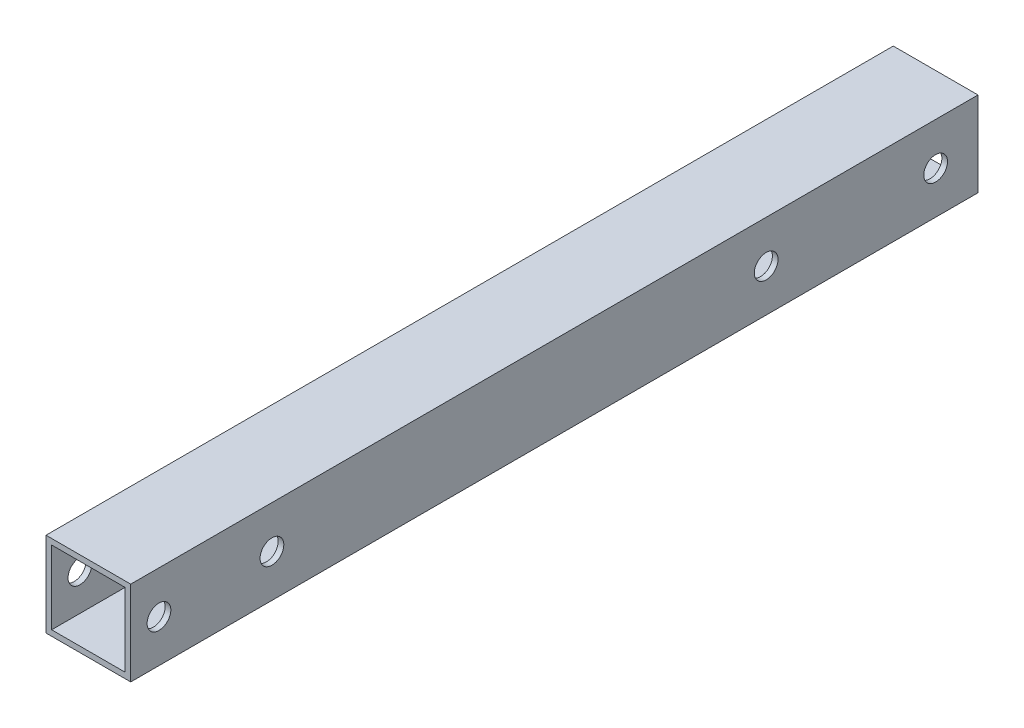
ISO-10303-21;
HEADER;
FILE_DESCRIPTION(('STEP AP214'),'2;1');
FILE_NAME('part.step','',(''),(''),'','','');
FILE_SCHEMA(('AUTOMOTIVE_DESIGN { 1 0 10303 214 1 1 1 1 }'));
ENDSEC;
DATA;
#1=APPLICATION_CONTEXT('core data for automotive mechanical design processes');
#2=APPLICATION_PROTOCOL_DEFINITION('international standard','automotive_design',2000,#1);
#3=PRODUCT_CONTEXT('',#1,'mechanical');
#4=PRODUCT('Part','Part','',(#3));
#5=PRODUCT_RELATED_PRODUCT_CATEGORY('part','',(#4));
#6=PRODUCT_DEFINITION_FORMATION('','',#4);
#7=PRODUCT_DEFINITION_CONTEXT('part definition',#1,'design');
#8=PRODUCT_DEFINITION('design','',#6,#7);
#9=PRODUCT_DEFINITION_SHAPE('','',#8);
#10=(LENGTH_UNIT() NAMED_UNIT(*) SI_UNIT(.MILLI.,.METRE.));
#11=(NAMED_UNIT(*) PLANE_ANGLE_UNIT() SI_UNIT($,.RADIAN.));
#12=(NAMED_UNIT(*) SI_UNIT($,.STERADIAN.) SOLID_ANGLE_UNIT());
#13=UNCERTAINTY_MEASURE_WITH_UNIT(LENGTH_MEASURE(1.E-05),#10,'distance_accuracy_value','');
#14=(GEOMETRIC_REPRESENTATION_CONTEXT(3) GLOBAL_UNCERTAINTY_ASSIGNED_CONTEXT((#13)) GLOBAL_UNIT_ASSIGNED_CONTEXT((#10,
#11,#12)) REPRESENTATION_CONTEXT('',''));
#15=CARTESIAN_POINT('',(0.,0.,0.));
#16=DIRECTION('',(0.,0.,1.));
#17=DIRECTION('',(1.,0.,0.));
#18=AXIS2_PLACEMENT_3D('',#15,#16,#17);
#19=CARTESIAN_POINT('',(0.,0.,150.));
#20=DIRECTION('',(0.,0.,1.));
#21=DIRECTION('',(1.,0.,0.));
#22=AXIS2_PLACEMENT_3D('',#19,#20,#21);
#23=PLANE('',#22);
#24=DIRECTION('',(0.,-1.,0.));
#25=VECTOR('',#24,1.);
#26=CARTESIAN_POINT('',(-7.5,7.5,150.));
#27=LINE('',#26,#25);
#28=CARTESIAN_POINT('',(-7.5,7.5,150.));
#29=VERTEX_POINT('',#28);
#30=CARTESIAN_POINT('',(-7.5,-7.5,150.));
#31=VERTEX_POINT('',#30);
#32=EDGE_CURVE('E164',#29,#31,#27,.T.);
#33=ORIENTED_EDGE('',*,*,#32,.T.);
#34=DIRECTION('',(1.,0.,0.));
#35=VECTOR('',#34,1.);
#36=CARTESIAN_POINT('',(7.5,-7.5,150.));
#37=LINE('',#36,#35);
#38=CARTESIAN_POINT('',(7.5,-7.5,150.));
#39=VERTEX_POINT('',#38);
#40=EDGE_CURVE('E167',#31,#39,#37,.T.);
#41=ORIENTED_EDGE('',*,*,#40,.T.);
#42=DIRECTION('',(0.,1.,0.));
#43=VECTOR('',#42,1.);
#44=CARTESIAN_POINT('',(7.5,7.5,150.));
#45=LINE('',#44,#43);
#46=CARTESIAN_POINT('',(7.5,7.5,150.));
#47=VERTEX_POINT('',#46);
#48=EDGE_CURVE('E170',#39,#47,#45,.T.);
#49=ORIENTED_EDGE('',*,*,#48,.T.);
#50=DIRECTION('',(-1.,0.,0.));
#51=VECTOR('',#50,1.);
#52=CARTESIAN_POINT('',(7.5,7.5,150.));
#53=LINE('',#52,#51);
#54=EDGE_CURVE('E172',#47,#29,#53,.T.);
#55=ORIENTED_EDGE('',*,*,#54,.T.);
#56=EDGE_LOOP('',(#33,#41,#49,#55));
#57=FACE_BOUND('',#56,.T.);
#58=DIRECTION('',(1.,0.,0.));
#59=VECTOR('',#58,1.);
#60=CARTESIAN_POINT('',(0.,-6.5,150.));
#61=LINE('',#60,#59);
#62=CARTESIAN_POINT('',(-6.5,-6.5,150.));
#63=VERTEX_POINT('',#62);
#64=CARTESIAN_POINT('',(6.5,-6.5,150.));
#65=VERTEX_POINT('',#64);
#66=EDGE_CURVE('E134',#63,#65,#61,.T.);
#67=ORIENTED_EDGE('',*,*,#66,.F.);
#68=DIRECTION('',(0.,-1.,0.));
#69=VECTOR('',#68,1.);
#70=CARTESIAN_POINT('',(-6.5,0.,150.));
#71=LINE('',#70,#69);
#72=CARTESIAN_POINT('',(-6.5,6.5,150.));
#73=VERTEX_POINT('',#72);
#74=EDGE_CURVE('E126',#73,#63,#71,.T.);
#75=ORIENTED_EDGE('',*,*,#74,.F.);
#76=DIRECTION('',(-1.,0.,0.));
#77=VECTOR('',#76,1.);
#78=CARTESIAN_POINT('',(0.,6.5,150.));
#79=LINE('',#78,#77);
#80=CARTESIAN_POINT('',(6.5,6.5,150.));
#81=VERTEX_POINT('',#80);
#82=EDGE_CURVE('E148',#81,#73,#79,.T.);
#83=ORIENTED_EDGE('',*,*,#82,.F.);
#84=DIRECTION('',(0.,1.,0.));
#85=VECTOR('',#84,1.);
#86=CARTESIAN_POINT('',(6.5,0.,150.));
#87=LINE('',#86,#85);
#88=EDGE_CURVE('E146',#65,#81,#87,.T.);
#89=ORIENTED_EDGE('',*,*,#88,.F.);
#90=EDGE_LOOP('',(#67,#75,#83,#89));
#91=FACE_BOUND('',#90,.T.);
#92=ADVANCED_FACE('F59',(#57,#91),#23,.T.);
#93=CARTESIAN_POINT('',(0.,0.,0.));
#94=DIRECTION('',(0.,0.,1.));
#95=DIRECTION('',(1.,0.,0.));
#96=AXIS2_PLACEMENT_3D('',#93,#94,#95);
#97=PLANE('',#96);
#98=DIRECTION('',(0.,-1.,0.));
#99=VECTOR('',#98,1.);
#100=CARTESIAN_POINT('',(-7.5,7.5,0.));
#101=LINE('',#100,#99);
#102=CARTESIAN_POINT('',(-7.5,7.5,0.));
#103=VERTEX_POINT('',#102);
#104=CARTESIAN_POINT('',(-7.5,-7.5,0.));
#105=VERTEX_POINT('',#104);
#106=EDGE_CURVE('E142',#103,#105,#101,.T.);
#107=ORIENTED_EDGE('',*,*,#106,.F.);
#108=DIRECTION('',(-1.,0.,0.));
#109=VECTOR('',#108,1.);
#110=CARTESIAN_POINT('',(7.5,7.5,0.));
#111=LINE('',#110,#109);
#112=CARTESIAN_POINT('',(7.5,7.5,0.));
#113=VERTEX_POINT('',#112);
#114=EDGE_CURVE('E168',#113,#103,#111,.T.);
#115=ORIENTED_EDGE('',*,*,#114,.F.);
#116=DIRECTION('',(0.,1.,0.));
#117=VECTOR('',#116,1.);
#118=CARTESIAN_POINT('',(7.5,7.5,0.));
#119=LINE('',#118,#117);
#120=CARTESIAN_POINT('',(7.5,-7.5,0.));
#121=VERTEX_POINT('',#120);
#122=EDGE_CURVE('E179',#121,#113,#119,.T.);
#123=ORIENTED_EDGE('',*,*,#122,.F.);
#124=DIRECTION('',(1.,0.,0.));
#125=VECTOR('',#124,1.);
#126=CARTESIAN_POINT('',(7.5,-7.5,0.));
#127=LINE('',#126,#125);
#128=EDGE_CURVE('E177',#105,#121,#127,.T.);
#129=ORIENTED_EDGE('',*,*,#128,.F.);
#130=EDGE_LOOP('',(#107,#115,#123,#129));
#131=FACE_BOUND('',#130,.T.);
#132=DIRECTION('',(0.,-1.,0.));
#133=VECTOR('',#132,1.);
#134=CARTESIAN_POINT('',(-6.5,0.,0.));
#135=LINE('',#134,#133);
#136=CARTESIAN_POINT('',(-6.5,6.5,0.));
#137=VERTEX_POINT('',#136);
#138=CARTESIAN_POINT('',(-6.5,-6.5,0.));
#139=VERTEX_POINT('',#138);
#140=EDGE_CURVE('E84',#137,#139,#135,.T.);
#141=ORIENTED_EDGE('',*,*,#140,.T.);
#142=DIRECTION('',(1.,0.,0.));
#143=VECTOR('',#142,1.);
#144=CARTESIAN_POINT('',(0.,-6.5,0.));
#145=LINE('',#144,#143);
#146=CARTESIAN_POINT('',(6.5,-6.5,0.));
#147=VERTEX_POINT('',#146);
#148=EDGE_CURVE('E141',#139,#147,#145,.T.);
#149=ORIENTED_EDGE('',*,*,#148,.T.);
#150=DIRECTION('',(0.,1.,0.));
#151=VECTOR('',#150,1.);
#152=CARTESIAN_POINT('',(6.5,0.,0.));
#153=LINE('',#152,#151);
#154=CARTESIAN_POINT('',(6.5,6.5,0.));
#155=VERTEX_POINT('',#154);
#156=EDGE_CURVE('E156',#147,#155,#153,.T.);
#157=ORIENTED_EDGE('',*,*,#156,.T.);
#158=DIRECTION('',(-1.,0.,0.));
#159=VECTOR('',#158,1.);
#160=CARTESIAN_POINT('',(0.,6.5,0.));
#161=LINE('',#160,#159);
#162=EDGE_CURVE('E135',#155,#137,#161,.T.);
#163=ORIENTED_EDGE('',*,*,#162,.T.);
#164=EDGE_LOOP('',(#141,#149,#157,#163));
#165=FACE_BOUND('',#164,.T.);
#166=ADVANCED_FACE('F257',(#131,#165),#97,.F.);
#167=CARTESIAN_POINT('',(-7.5,7.5,150.));
#168=DIRECTION('',(1.,0.,0.));
#169=DIRECTION('',(0.,1.,0.));
#170=AXIS2_PLACEMENT_3D('',#167,#168,#169);
#171=PLANE('',#170);
#172=CARTESIAN_POINT('',(-7.5,0.,145.));
#173=DIRECTION('',(1.,0.,0.));
#174=DIRECTION('',(0.,1.,0.));
#175=AXIS2_PLACEMENT_3D('',#172,#173,#174);
#176=CIRCLE('',#175,2.09999999999999);
#177=CARTESIAN_POINT('',(-7.5,2.09999999999999,145.));
#178=VERTEX_POINT('',#177);
#179=EDGE_CURVE('E199',#178,#178,#176,.T.);
#180=ORIENTED_EDGE('',*,*,#179,.T.);
#181=EDGE_LOOP('',(#180));
#182=FACE_BOUND('',#181,.T.);
#183=CARTESIAN_POINT('',(-7.5,0.,125.));
#184=DIRECTION('',(1.,0.,0.));
#185=DIRECTION('',(0.,1.,0.));
#186=AXIS2_PLACEMENT_3D('',#183,#184,#185);
#187=CIRCLE('',#186,2.09999999999999);
#188=CARTESIAN_POINT('',(-7.5,2.09999999999999,125.));
#189=VERTEX_POINT('',#188);
#190=EDGE_CURVE('E210',#189,#189,#187,.T.);
#191=ORIENTED_EDGE('',*,*,#190,.T.);
#192=EDGE_LOOP('',(#191));
#193=FACE_BOUND('',#192,.T.);
#194=CARTESIAN_POINT('',(-7.5,0.,7.5));
#195=DIRECTION('',(1.,0.,0.));
#196=DIRECTION('',(0.,1.,0.));
#197=AXIS2_PLACEMENT_3D('',#194,#195,#196);
#198=CIRCLE('',#197,2.1);
#199=CARTESIAN_POINT('',(-7.5,2.1,7.5));
#200=VERTEX_POINT('',#199);
#201=EDGE_CURVE('E193',#200,#200,#198,.T.);
#202=ORIENTED_EDGE('',*,*,#201,.T.);
#203=EDGE_LOOP('',(#202));
#204=FACE_BOUND('',#203,.T.);
#205=CARTESIAN_POINT('',(-7.5,0.,37.5));
#206=DIRECTION('',(1.,0.,0.));
#207=DIRECTION('',(0.,1.,0.));
#208=AXIS2_PLACEMENT_3D('',#205,#206,#207);
#209=CIRCLE('',#208,2.1);
#210=CARTESIAN_POINT('',(-7.5,2.1,37.5));
#211=VERTEX_POINT('',#210);
#212=EDGE_CURVE('E227',#211,#211,#209,.T.);
#213=ORIENTED_EDGE('',*,*,#212,.T.);
#214=EDGE_LOOP('',(#213));
#215=FACE_BOUND('',#214,.T.);
#216=ORIENTED_EDGE('',*,*,#106,.T.);
#217=DIRECTION('',(0.,0.,-1.));
#218=VECTOR('',#217,1.);
#219=CARTESIAN_POINT('',(-7.5,-7.5,150.));
#220=LINE('',#219,#218);
#221=EDGE_CURVE('E12',#31,#105,#220,.T.);
#222=ORIENTED_EDGE('',*,*,#221,.F.);
#223=ORIENTED_EDGE('',*,*,#32,.F.);
#224=DIRECTION('',(0.,0.,-1.));
#225=VECTOR('',#224,1.);
#226=CARTESIAN_POINT('',(-7.5,7.5,150.));
#227=LINE('',#226,#225);
#228=EDGE_CURVE('E174',#29,#103,#227,.T.);
#229=ORIENTED_EDGE('',*,*,#228,.T.);
#230=EDGE_LOOP('',(#216,#222,#223,#229));
#231=FACE_BOUND('',#230,.T.);
#232=ADVANCED_FACE('F61',(#182,#193,#204,#215,#231),#171,.F.);
#233=CARTESIAN_POINT('',(7.5,-7.5,150.));
#234=DIRECTION('',(0.,1.,0.));
#235=DIRECTION('',(-1.,0.,0.));
#236=AXIS2_PLACEMENT_3D('',#233,#234,#235);
#237=PLANE('',#236);
#238=ORIENTED_EDGE('',*,*,#128,.T.);
#239=DIRECTION('',(0.,0.,-1.));
#240=VECTOR('',#239,1.);
#241=CARTESIAN_POINT('',(7.5,-7.5,150.));
#242=LINE('',#241,#240);
#243=EDGE_CURVE('E68',#39,#121,#242,.T.);
#244=ORIENTED_EDGE('',*,*,#243,.F.);
#245=ORIENTED_EDGE('',*,*,#40,.F.);
#246=ORIENTED_EDGE('',*,*,#221,.T.);
#247=EDGE_LOOP('',(#238,#244,#245,#246));
#248=FACE_BOUND('',#247,.T.);
#249=ADVANCED_FACE('F256',(#248),#237,.F.);
#250=CARTESIAN_POINT('',(7.5,7.5,150.));
#251=DIRECTION('',(-1.,0.,0.));
#252=DIRECTION('',(0.,-1.,0.));
#253=AXIS2_PLACEMENT_3D('',#250,#251,#252);
#254=PLANE('',#253);
#255=CARTESIAN_POINT('',(7.5,0.,145.));
#256=DIRECTION('',(1.,0.,0.));
#257=DIRECTION('',(0.,1.,0.));
#258=AXIS2_PLACEMENT_3D('',#255,#256,#257);
#259=CIRCLE('',#258,2.09999999999999);
#260=CARTESIAN_POINT('',(7.5,2.09999999999999,145.));
#261=VERTEX_POINT('',#260);
#262=EDGE_CURVE('E205',#261,#261,#259,.T.);
#263=ORIENTED_EDGE('',*,*,#262,.F.);
#264=EDGE_LOOP('',(#263));
#265=FACE_BOUND('',#264,.T.);
#266=CARTESIAN_POINT('',(7.5,0.,125.));
#267=DIRECTION('',(1.,0.,0.));
#268=DIRECTION('',(0.,1.,0.));
#269=AXIS2_PLACEMENT_3D('',#266,#267,#268);
#270=CIRCLE('',#269,2.09999999999999);
#271=CARTESIAN_POINT('',(7.5,2.09999999999999,125.));
#272=VERTEX_POINT('',#271);
#273=EDGE_CURVE('E215',#272,#272,#270,.T.);
#274=ORIENTED_EDGE('',*,*,#273,.F.);
#275=EDGE_LOOP('',(#274));
#276=FACE_BOUND('',#275,.T.);
#277=CARTESIAN_POINT('',(7.5,0.,7.5));
#278=DIRECTION('',(1.,0.,0.));
#279=DIRECTION('',(0.,1.,0.));
#280=AXIS2_PLACEMENT_3D('',#277,#278,#279);
#281=CIRCLE('',#280,2.1);
#282=CARTESIAN_POINT('',(7.5,2.1,7.5));
#283=VERTEX_POINT('',#282);
#284=EDGE_CURVE('E224',#283,#283,#281,.T.);
#285=ORIENTED_EDGE('',*,*,#284,.F.);
#286=EDGE_LOOP('',(#285));
#287=FACE_BOUND('',#286,.T.);
#288=CARTESIAN_POINT('',(7.5,0.,37.5));
#289=DIRECTION('',(1.,0.,0.));
#290=DIRECTION('',(0.,1.,0.));
#291=AXIS2_PLACEMENT_3D('',#288,#289,#290);
#292=CIRCLE('',#291,2.1);
#293=CARTESIAN_POINT('',(7.5,2.1,37.5));
#294=VERTEX_POINT('',#293);
#295=EDGE_CURVE('E221',#294,#294,#292,.T.);
#296=ORIENTED_EDGE('',*,*,#295,.F.);
#297=EDGE_LOOP('',(#296));
#298=FACE_BOUND('',#297,.T.);
#299=ORIENTED_EDGE('',*,*,#122,.T.);
#300=DIRECTION('',(0.,0.,-1.));
#301=VECTOR('',#300,1.);
#302=CARTESIAN_POINT('',(7.5,7.5,150.));
#303=LINE('',#302,#301);
#304=EDGE_CURVE('E184',#47,#113,#303,.T.);
#305=ORIENTED_EDGE('',*,*,#304,.F.);
#306=ORIENTED_EDGE('',*,*,#48,.F.);
#307=ORIENTED_EDGE('',*,*,#243,.T.);
#308=EDGE_LOOP('',(#299,#305,#306,#307));
#309=FACE_BOUND('',#308,.T.);
#310=ADVANCED_FACE('F274',(#265,#276,#287,#298,#309),#254,.F.);
#311=CARTESIAN_POINT('',(7.5,7.5,150.));
#312=DIRECTION('',(0.,-1.,0.));
#313=DIRECTION('',(1.,0.,0.));
#314=AXIS2_PLACEMENT_3D('',#311,#312,#313);
#315=PLANE('',#314);
#316=ORIENTED_EDGE('',*,*,#114,.T.);
#317=ORIENTED_EDGE('',*,*,#228,.F.);
#318=ORIENTED_EDGE('',*,*,#54,.F.);
#319=ORIENTED_EDGE('',*,*,#304,.T.);
#320=EDGE_LOOP('',(#316,#317,#318,#319));
#321=FACE_BOUND('',#320,.T.);
#322=ADVANCED_FACE('F241',(#321),#315,.F.);
#323=CARTESIAN_POINT('',(-6.5,0.,150.));
#324=DIRECTION('',(1.,0.,0.));
#325=DIRECTION('',(0.,1.,0.));
#326=AXIS2_PLACEMENT_3D('',#323,#324,#325);
#327=PLANE('',#326);
#328=CARTESIAN_POINT('',(-6.5,0.,145.));
#329=DIRECTION('',(1.,0.,0.));
#330=DIRECTION('',(0.,1.,0.));
#331=AXIS2_PLACEMENT_3D('',#328,#329,#330);
#332=CIRCLE('',#331,2.09999999999999);
#333=CARTESIAN_POINT('',(-6.5,2.09999999999999,145.));
#334=VERTEX_POINT('',#333);
#335=EDGE_CURVE('E218',#334,#334,#332,.T.);
#336=ORIENTED_EDGE('',*,*,#335,.F.);
#337=EDGE_LOOP('',(#336));
#338=FACE_BOUND('',#337,.T.);
#339=CARTESIAN_POINT('',(-6.5,0.,125.));
#340=DIRECTION('',(1.,0.,0.));
#341=DIRECTION('',(0.,1.,0.));
#342=AXIS2_PLACEMENT_3D('',#339,#340,#341);
#343=CIRCLE('',#342,2.09999999999999);
#344=CARTESIAN_POINT('',(-6.5,2.09999999999999,125.));
#345=VERTEX_POINT('',#344);
#346=EDGE_CURVE('E198',#345,#345,#343,.T.);
#347=ORIENTED_EDGE('',*,*,#346,.F.);
#348=EDGE_LOOP('',(#347));
#349=FACE_BOUND('',#348,.T.);
#350=CARTESIAN_POINT('',(-6.5,0.,7.5));
#351=DIRECTION('',(1.,0.,0.));
#352=DIRECTION('',(0.,1.,0.));
#353=AXIS2_PLACEMENT_3D('',#350,#351,#352);
#354=CIRCLE('',#353,2.1);
#355=CARTESIAN_POINT('',(-6.5,2.1,7.5));
#356=VERTEX_POINT('',#355);
#357=EDGE_CURVE('E154',#356,#356,#354,.T.);
#358=ORIENTED_EDGE('',*,*,#357,.F.);
#359=EDGE_LOOP('',(#358));
#360=FACE_BOUND('',#359,.T.);
#361=CARTESIAN_POINT('',(-6.5,0.,37.5));
#362=DIRECTION('',(1.,0.,0.));
#363=DIRECTION('',(0.,1.,0.));
#364=AXIS2_PLACEMENT_3D('',#361,#362,#363);
#365=CIRCLE('',#364,2.1);
#366=CARTESIAN_POINT('',(-6.5,2.1,37.5));
#367=VERTEX_POINT('',#366);
#368=EDGE_CURVE('E192',#367,#367,#365,.T.);
#369=ORIENTED_EDGE('',*,*,#368,.F.);
#370=EDGE_LOOP('',(#369));
#371=FACE_BOUND('',#370,.T.);
#372=ORIENTED_EDGE('',*,*,#140,.F.);
#373=DIRECTION('',(0.,0.,-1.));
#374=VECTOR('',#373,1.);
#375=CARTESIAN_POINT('',(-6.5,6.5,150.));
#376=LINE('',#375,#374);
#377=EDGE_CURVE('E130',#73,#137,#376,.T.);
#378=ORIENTED_EDGE('',*,*,#377,.F.);
#379=ORIENTED_EDGE('',*,*,#74,.T.);
#380=DIRECTION('',(0.,0.,-1.));
#381=VECTOR('',#380,1.);
#382=CARTESIAN_POINT('',(-6.5,-6.5,150.));
#383=LINE('',#382,#381);
#384=EDGE_CURVE('E129',#63,#139,#383,.T.);
#385=ORIENTED_EDGE('',*,*,#384,.T.);
#386=EDGE_LOOP('',(#372,#378,#379,#385));
#387=FACE_BOUND('',#386,.T.);
#388=ADVANCED_FACE('F128',(#338,#349,#360,#371,#387),#327,.T.);
#389=CARTESIAN_POINT('',(0.,-6.5,150.));
#390=DIRECTION('',(0.,1.,0.));
#391=DIRECTION('',(-1.,0.,0.));
#392=AXIS2_PLACEMENT_3D('',#389,#390,#391);
#393=PLANE('',#392);
#394=ORIENTED_EDGE('',*,*,#148,.F.);
#395=ORIENTED_EDGE('',*,*,#384,.F.);
#396=ORIENTED_EDGE('',*,*,#66,.T.);
#397=DIRECTION('',(0.,0.,-1.));
#398=VECTOR('',#397,1.);
#399=CARTESIAN_POINT('',(6.5,-6.5,150.));
#400=LINE('',#399,#398);
#401=EDGE_CURVE('E143',#65,#147,#400,.T.);
#402=ORIENTED_EDGE('',*,*,#401,.T.);
#403=EDGE_LOOP('',(#394,#395,#396,#402));
#404=FACE_BOUND('',#403,.T.);
#405=ADVANCED_FACE('F138',(#404),#393,.T.);
#406=CARTESIAN_POINT('',(6.5,0.,150.));
#407=DIRECTION('',(-1.,0.,0.));
#408=DIRECTION('',(0.,-1.,0.));
#409=AXIS2_PLACEMENT_3D('',#406,#407,#408);
#410=PLANE('',#409);
#411=CARTESIAN_POINT('',(6.5,0.,145.));
#412=DIRECTION('',(-1.,0.,0.));
#413=DIRECTION('',(0.,-1.,0.));
#414=AXIS2_PLACEMENT_3D('',#411,#412,#413);
#415=CIRCLE('',#414,2.09999999999999);
#416=CARTESIAN_POINT('',(6.5,-2.09999999999999,145.));
#417=VERTEX_POINT('',#416);
#418=EDGE_CURVE('E63',#417,#417,#415,.T.);
#419=ORIENTED_EDGE('',*,*,#418,.F.);
#420=EDGE_LOOP('',(#419));
#421=FACE_BOUND('',#420,.T.);
#422=CARTESIAN_POINT('',(6.5,0.,125.));
#423=DIRECTION('',(-1.,0.,0.));
#424=DIRECTION('',(0.,-1.,0.));
#425=AXIS2_PLACEMENT_3D('',#422,#423,#424);
#426=CIRCLE('',#425,2.09999999999999);
#427=CARTESIAN_POINT('',(6.5,-2.09999999999999,125.));
#428=VERTEX_POINT('',#427);
#429=EDGE_CURVE('E196',#428,#428,#426,.T.);
#430=ORIENTED_EDGE('',*,*,#429,.F.);
#431=EDGE_LOOP('',(#430));
#432=FACE_BOUND('',#431,.T.);
#433=CARTESIAN_POINT('',(6.5,0.,7.5));
#434=DIRECTION('',(-1.,0.,0.));
#435=DIRECTION('',(0.,-1.,0.));
#436=AXIS2_PLACEMENT_3D('',#433,#434,#435);
#437=CIRCLE('',#436,2.1);
#438=CARTESIAN_POINT('',(6.5,-2.1,7.5));
#439=VERTEX_POINT('',#438);
#440=EDGE_CURVE('E194',#439,#439,#437,.T.);
#441=ORIENTED_EDGE('',*,*,#440,.F.);
#442=EDGE_LOOP('',(#441));
#443=FACE_BOUND('',#442,.T.);
#444=CARTESIAN_POINT('',(6.5,0.,37.5));
#445=DIRECTION('',(-1.,0.,0.));
#446=DIRECTION('',(0.,-1.,0.));
#447=AXIS2_PLACEMENT_3D('',#444,#445,#446);
#448=CIRCLE('',#447,2.1);
#449=CARTESIAN_POINT('',(6.5,-2.1,37.5));
#450=VERTEX_POINT('',#449);
#451=EDGE_CURVE('E189',#450,#450,#448,.T.);
#452=ORIENTED_EDGE('',*,*,#451,.F.);
#453=EDGE_LOOP('',(#452));
#454=FACE_BOUND('',#453,.T.);
#455=ORIENTED_EDGE('',*,*,#156,.F.);
#456=ORIENTED_EDGE('',*,*,#401,.F.);
#457=ORIENTED_EDGE('',*,*,#88,.T.);
#458=DIRECTION('',(0.,0.,-1.));
#459=VECTOR('',#458,1.);
#460=CARTESIAN_POINT('',(6.5,6.5,150.));
#461=LINE('',#460,#459);
#462=EDGE_CURVE('E76',#81,#155,#461,.T.);
#463=ORIENTED_EDGE('',*,*,#462,.T.);
#464=EDGE_LOOP('',(#455,#456,#457,#463));
#465=FACE_BOUND('',#464,.T.);
#466=ADVANCED_FACE('F294',(#421,#432,#443,#454,#465),#410,.T.);
#467=CARTESIAN_POINT('',(0.,6.5,150.));
#468=DIRECTION('',(0.,-1.,0.));
#469=DIRECTION('',(1.,0.,0.));
#470=AXIS2_PLACEMENT_3D('',#467,#468,#469);
#471=PLANE('',#470);
#472=ORIENTED_EDGE('',*,*,#162,.F.);
#473=ORIENTED_EDGE('',*,*,#462,.F.);
#474=ORIENTED_EDGE('',*,*,#82,.T.);
#475=ORIENTED_EDGE('',*,*,#377,.T.);
#476=EDGE_LOOP('',(#472,#473,#474,#475));
#477=FACE_BOUND('',#476,.T.);
#478=ADVANCED_FACE('F297',(#477),#471,.T.);
#479=CARTESIAN_POINT('',(-7.5,0.,37.5));
#480=DIRECTION('',(1.,0.,0.));
#481=DIRECTION('',(0.,1.,0.));
#482=AXIS2_PLACEMENT_3D('',#479,#480,#481);
#483=CYLINDRICAL_SURFACE('',#482,2.1);
#484=ORIENTED_EDGE('',*,*,#451,.T.);
#485=EDGE_LOOP('',(#484));
#486=FACE_BOUND('',#485,.T.);
#487=ORIENTED_EDGE('',*,*,#295,.T.);
#488=EDGE_LOOP('',(#487));
#489=FACE_BOUND('',#488,.T.);
#490=ADVANCED_FACE('F251',(#486,#489),#483,.F.);
#491=CARTESIAN_POINT('',(-7.5,0.,7.5));
#492=DIRECTION('',(1.,0.,0.));
#493=DIRECTION('',(0.,1.,0.));
#494=AXIS2_PLACEMENT_3D('',#491,#492,#493);
#495=CYLINDRICAL_SURFACE('',#494,2.1);
#496=ORIENTED_EDGE('',*,*,#440,.T.);
#497=EDGE_LOOP('',(#496));
#498=FACE_BOUND('',#497,.T.);
#499=ORIENTED_EDGE('',*,*,#284,.T.);
#500=EDGE_LOOP('',(#499));
#501=FACE_BOUND('',#500,.T.);
#502=ADVANCED_FACE('F249',(#498,#501),#495,.F.);
#503=ORIENTED_EDGE('',*,*,#368,.T.);
#504=EDGE_LOOP('',(#503));
#505=FACE_BOUND('',#504,.T.);
#506=ORIENTED_EDGE('',*,*,#212,.F.);
#507=EDGE_LOOP('',(#506));
#508=FACE_BOUND('',#507,.T.);
#509=ADVANCED_FACE('F246',(#505,#508),#483,.F.);
#510=ORIENTED_EDGE('',*,*,#357,.T.);
#511=EDGE_LOOP('',(#510));
#512=FACE_BOUND('',#511,.T.);
#513=ORIENTED_EDGE('',*,*,#201,.F.);
#514=EDGE_LOOP('',(#513));
#515=FACE_BOUND('',#514,.T.);
#516=ADVANCED_FACE('F236',(#512,#515),#495,.F.);
#517=CARTESIAN_POINT('',(-7.5,0.,125.));
#518=DIRECTION('',(1.,0.,0.));
#519=DIRECTION('',(0.,1.,0.));
#520=AXIS2_PLACEMENT_3D('',#517,#518,#519);
#521=CYLINDRICAL_SURFACE('',#520,2.09999999999999);
#522=ORIENTED_EDGE('',*,*,#429,.T.);
#523=EDGE_LOOP('',(#522));
#524=FACE_BOUND('',#523,.T.);
#525=ORIENTED_EDGE('',*,*,#273,.T.);
#526=EDGE_LOOP('',(#525));
#527=FACE_BOUND('',#526,.T.);
#528=ADVANCED_FACE('F306',(#524,#527),#521,.F.);
#529=CARTESIAN_POINT('',(-7.5,0.,145.));
#530=DIRECTION('',(1.,0.,0.));
#531=DIRECTION('',(0.,1.,0.));
#532=AXIS2_PLACEMENT_3D('',#529,#530,#531);
#533=CYLINDRICAL_SURFACE('',#532,2.09999999999999);
#534=ORIENTED_EDGE('',*,*,#418,.T.);
#535=EDGE_LOOP('',(#534));
#536=FACE_BOUND('',#535,.T.);
#537=ORIENTED_EDGE('',*,*,#262,.T.);
#538=EDGE_LOOP('',(#537));
#539=FACE_BOUND('',#538,.T.);
#540=ADVANCED_FACE('F309',(#536,#539),#533,.F.);
#541=ORIENTED_EDGE('',*,*,#346,.T.);
#542=EDGE_LOOP('',(#541));
#543=FACE_BOUND('',#542,.T.);
#544=ORIENTED_EDGE('',*,*,#190,.F.);
#545=EDGE_LOOP('',(#544));
#546=FACE_BOUND('',#545,.T.);
#547=ADVANCED_FACE('F310',(#543,#546),#521,.F.);
#548=ORIENTED_EDGE('',*,*,#335,.T.);
#549=EDGE_LOOP('',(#548));
#550=FACE_BOUND('',#549,.T.);
#551=ORIENTED_EDGE('',*,*,#179,.F.);
#552=EDGE_LOOP('',(#551));
#553=FACE_BOUND('',#552,.T.);
#554=ADVANCED_FACE('F313',(#550,#553),#533,.F.);
#555=CLOSED_SHELL('',(#92,#166,#232,#249,#310,#322,#388,#405,#466,#478,#490,#502,#509,#516,#528,
#540,#547,#554));
#556=MANIFOLD_SOLID_BREP('B2',#555);
#557=ADVANCED_BREP_SHAPE_REPRESENTATION('',(#18,#556),#14);
#558=SHAPE_DEFINITION_REPRESENTATION(#9,#557);
ENDSEC;
END-ISO-10303-21;
